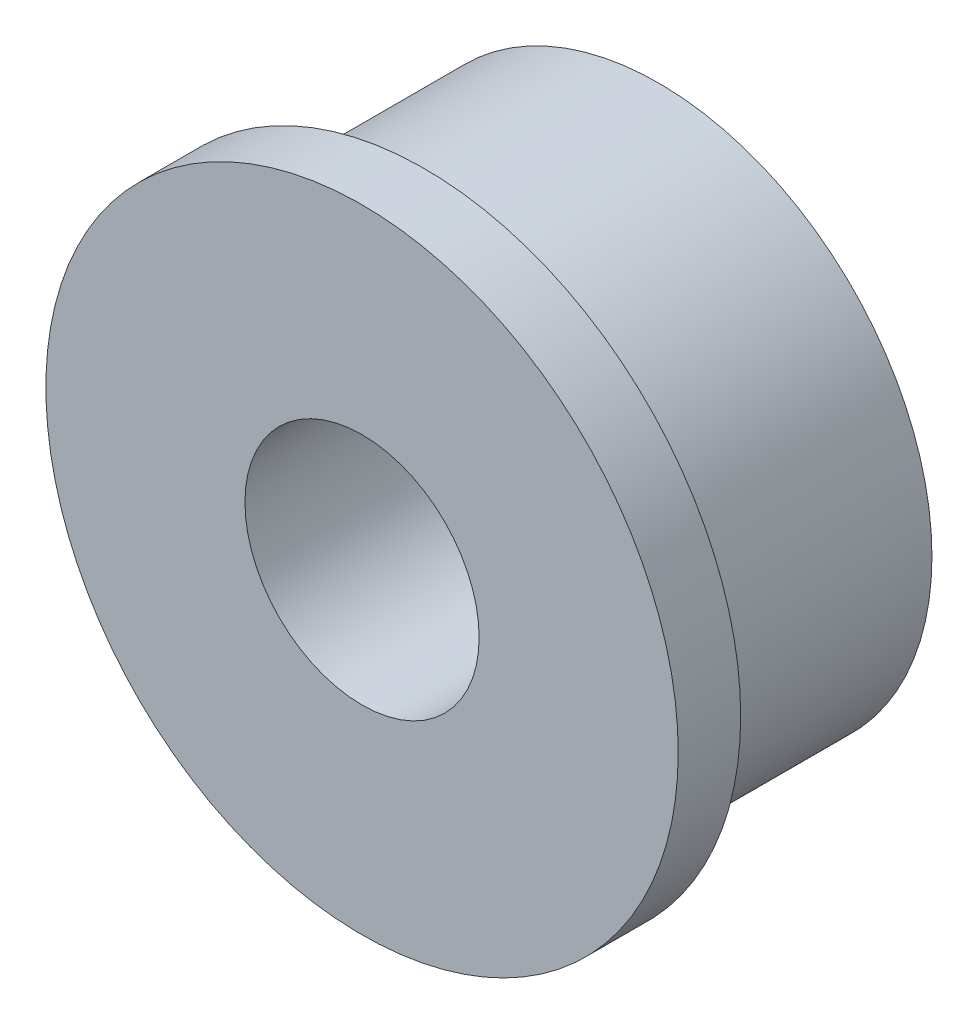
ISO-10303-21;
HEADER;
FILE_DESCRIPTION(('STEP AP214'),'2;1');
FILE_NAME('part.step','',(''),(''),'','','');
FILE_SCHEMA(('AUTOMOTIVE_DESIGN { 1 0 10303 214 1 1 1 1 }'));
ENDSEC;
DATA;
#1=APPLICATION_CONTEXT('core data for automotive mechanical design processes');
#2=APPLICATION_PROTOCOL_DEFINITION('international standard','automotive_design',2000,#1);
#3=PRODUCT_CONTEXT('',#1,'mechanical');
#4=PRODUCT('Part','Part','',(#3));
#5=PRODUCT_RELATED_PRODUCT_CATEGORY('part','',(#4));
#6=PRODUCT_DEFINITION_FORMATION('','',#4);
#7=PRODUCT_DEFINITION_CONTEXT('part definition',#1,'design');
#8=PRODUCT_DEFINITION('design','',#6,#7);
#9=PRODUCT_DEFINITION_SHAPE('','',#8);
#10=(LENGTH_UNIT() NAMED_UNIT(*) SI_UNIT(.MILLI.,.METRE.));
#11=(NAMED_UNIT(*) PLANE_ANGLE_UNIT() SI_UNIT($,.RADIAN.));
#12=(NAMED_UNIT(*) SI_UNIT($,.STERADIAN.) SOLID_ANGLE_UNIT());
#13=UNCERTAINTY_MEASURE_WITH_UNIT(LENGTH_MEASURE(1.E-05),#10,'distance_accuracy_value','');
#14=(GEOMETRIC_REPRESENTATION_CONTEXT(3) GLOBAL_UNCERTAINTY_ASSIGNED_CONTEXT((#13)) GLOBAL_UNIT_ASSIGNED_CONTEXT((#10,
#11,#12)) REPRESENTATION_CONTEXT('',''));
#15=CARTESIAN_POINT('',(0.,0.,0.));
#16=DIRECTION('',(0.,0.,1.));
#17=DIRECTION('',(1.,0.,0.));
#18=AXIS2_PLACEMENT_3D('',#15,#16,#17);
#19=CARTESIAN_POINT('',(0.,0.,0.));
#20=DIRECTION('',(0.,0.,1.));
#21=DIRECTION('',(1.,0.,0.));
#22=AXIS2_PLACEMENT_3D('',#19,#20,#21);
#23=PLANE('',#22);
#24=CARTESIAN_POINT('',(0.,0.,0.));
#25=DIRECTION('',(0.,0.,1.));
#26=DIRECTION('',(1.,0.,0.));
#27=AXIS2_PLACEMENT_3D('',#24,#25,#26);
#28=CIRCLE('',#27,3.5);
#29=CARTESIAN_POINT('',(3.5,0.,0.));
#30=VERTEX_POINT('',#29);
#31=EDGE_CURVE('E36',#30,#30,#28,.T.);
#32=ORIENTED_EDGE('',*,*,#31,.F.);
#33=EDGE_LOOP('',(#32));
#34=FACE_BOUND('',#33,.T.);
#35=CARTESIAN_POINT('',(0.,0.,0.));
#36=DIRECTION('',(0.,0.,1.));
#37=DIRECTION('',(1.,0.,0.));
#38=AXIS2_PLACEMENT_3D('',#35,#36,#37);
#39=CIRCLE('',#38,1.5);
#40=CARTESIAN_POINT('',(1.5,0.,0.));
#41=VERTEX_POINT('',#40);
#42=EDGE_CURVE('E43',#41,#41,#39,.T.);
#43=ORIENTED_EDGE('',*,*,#42,.T.);
#44=EDGE_LOOP('',(#43));
#45=FACE_BOUND('',#44,.T.);
#46=ADVANCED_FACE('F32',(#34,#45),#23,.F.);
#47=CARTESIAN_POINT('',(0.,0.,3.));
#48=DIRECTION('',(0.,0.,-1.));
#49=DIRECTION('',(-1.,0.,0.));
#50=AXIS2_PLACEMENT_3D('',#47,#48,#49);
#51=CYLINDRICAL_SURFACE('',#50,3.5);
#52=CARTESIAN_POINT('',(0.,0.,3.));
#53=DIRECTION('',(0.,0.,1.));
#54=DIRECTION('',(1.,0.,0.));
#55=AXIS2_PLACEMENT_3D('',#52,#53,#54);
#56=CIRCLE('',#55,3.5);
#57=CARTESIAN_POINT('',(3.5,0.,3.));
#58=VERTEX_POINT('',#57);
#59=EDGE_CURVE('E10',#58,#58,#56,.T.);
#60=ORIENTED_EDGE('',*,*,#59,.F.);
#61=EDGE_LOOP('',(#60));
#62=FACE_BOUND('',#61,.T.);
#63=ORIENTED_EDGE('',*,*,#31,.T.);
#64=EDGE_LOOP('',(#63));
#65=FACE_BOUND('',#64,.T.);
#66=ADVANCED_FACE('F34',(#62,#65),#51,.T.);
#67=CARTESIAN_POINT('',(0.,0.,3.));
#68=DIRECTION('',(0.,0.,-1.));
#69=DIRECTION('',(-1.,0.,0.));
#70=AXIS2_PLACEMENT_3D('',#67,#68,#69);
#71=CYLINDRICAL_SURFACE('',#70,1.5);
#72=ORIENTED_EDGE('',*,*,#42,.F.);
#73=EDGE_LOOP('',(#72));
#74=FACE_BOUND('',#73,.T.);
#75=CARTESIAN_POINT('',(0.,0.,3.8));
#76=DIRECTION('',(0.,0.,1.));
#77=DIRECTION('',(1.,0.,0.));
#78=AXIS2_PLACEMENT_3D('',#75,#76,#77);
#79=CIRCLE('',#78,1.5);
#80=CARTESIAN_POINT('',(1.5,0.,3.8));
#81=VERTEX_POINT('',#80);
#82=EDGE_CURVE('E51',#81,#81,#79,.T.);
#83=ORIENTED_EDGE('',*,*,#82,.T.);
#84=EDGE_LOOP('',(#83));
#85=FACE_BOUND('',#84,.T.);
#86=ADVANCED_FACE('F57',(#74,#85),#71,.F.);
#87=CARTESIAN_POINT('',(0.,0.,3.8));
#88=DIRECTION('',(0.,0.,1.));
#89=DIRECTION('',(1.,0.,0.));
#90=AXIS2_PLACEMENT_3D('',#87,#88,#89);
#91=PLANE('',#90);
#92=CARTESIAN_POINT('',(0.,0.,3.8));
#93=DIRECTION('',(0.,0.,1.));
#94=DIRECTION('',(1.,0.,0.));
#95=AXIS2_PLACEMENT_3D('',#92,#93,#94);
#96=CIRCLE('',#95,4.05);
#97=CARTESIAN_POINT('',(4.05,0.,3.8));
#98=VERTEX_POINT('',#97);
#99=EDGE_CURVE('E47',#98,#98,#96,.T.);
#100=ORIENTED_EDGE('',*,*,#99,.T.);
#101=EDGE_LOOP('',(#100));
#102=FACE_BOUND('',#101,.T.);
#103=ORIENTED_EDGE('',*,*,#82,.F.);
#104=EDGE_LOOP('',(#103));
#105=FACE_BOUND('',#104,.T.);
#106=ADVANCED_FACE('F59',(#102,#105),#91,.T.);
#107=CARTESIAN_POINT('',(0.,0.,3.));
#108=DIRECTION('',(0.,0.,1.));
#109=DIRECTION('',(1.,0.,0.));
#110=AXIS2_PLACEMENT_3D('',#107,#108,#109);
#111=PLANE('',#110);
#112=ORIENTED_EDGE('',*,*,#59,.T.);
#113=EDGE_LOOP('',(#112));
#114=FACE_BOUND('',#113,.T.);
#115=CARTESIAN_POINT('',(0.,0.,3.));
#116=DIRECTION('',(0.,0.,1.));
#117=DIRECTION('',(1.,0.,0.));
#118=AXIS2_PLACEMENT_3D('',#115,#116,#117);
#119=CIRCLE('',#118,4.05);
#120=CARTESIAN_POINT('',(4.05,0.,3.));
#121=VERTEX_POINT('',#120);
#122=EDGE_CURVE('E48',#121,#121,#119,.T.);
#123=ORIENTED_EDGE('',*,*,#122,.F.);
#124=EDGE_LOOP('',(#123));
#125=FACE_BOUND('',#124,.T.);
#126=ADVANCED_FACE('F61',(#114,#125),#111,.F.);
#127=CARTESIAN_POINT('',(0.,0.,3.8));
#128=DIRECTION('',(0.,0.,-1.));
#129=DIRECTION('',(-1.,0.,0.));
#130=AXIS2_PLACEMENT_3D('',#127,#128,#129);
#131=CYLINDRICAL_SURFACE('',#130,4.05);
#132=ORIENTED_EDGE('',*,*,#99,.F.);
#133=EDGE_LOOP('',(#132));
#134=FACE_BOUND('',#133,.T.);
#135=ORIENTED_EDGE('',*,*,#122,.T.);
#136=EDGE_LOOP('',(#135));
#137=FACE_BOUND('',#136,.T.);
#138=ADVANCED_FACE('F68',(#134,#137),#131,.T.);
#139=CLOSED_SHELL('',(#46,#66,#86,#106,#126,#138));
#140=MANIFOLD_SOLID_BREP('B2',#139);
#141=ADVANCED_BREP_SHAPE_REPRESENTATION('',(#18,#140),#14);
#142=SHAPE_DEFINITION_REPRESENTATION(#9,#141);
ENDSEC;
END-ISO-10303-21;
